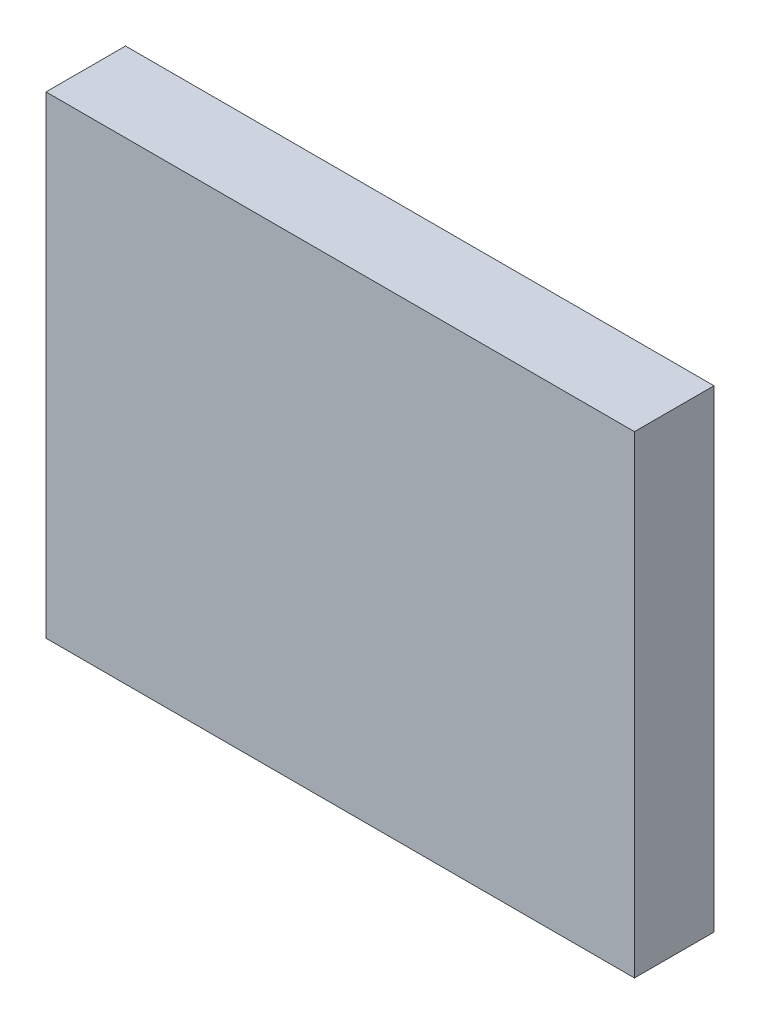
ISO-10303-21;
HEADER;
FILE_DESCRIPTION(('STEP AP214'),'2;1');
FILE_NAME('part.step','',(''),(''),'','','');
FILE_SCHEMA(('AUTOMOTIVE_DESIGN { 1 0 10303 214 1 1 1 1 }'));
ENDSEC;
DATA;
#1=APPLICATION_CONTEXT('core data for automotive mechanical design processes');
#2=APPLICATION_PROTOCOL_DEFINITION('international standard','automotive_design',2000,#1);
#3=PRODUCT_CONTEXT('',#1,'mechanical');
#4=PRODUCT('Part','Part','',(#3));
#5=PRODUCT_RELATED_PRODUCT_CATEGORY('part','',(#4));
#6=PRODUCT_DEFINITION_FORMATION('','',#4);
#7=PRODUCT_DEFINITION_CONTEXT('part definition',#1,'design');
#8=PRODUCT_DEFINITION('design','',#6,#7);
#9=PRODUCT_DEFINITION_SHAPE('','',#8);
#10=(LENGTH_UNIT() NAMED_UNIT(*) SI_UNIT(.MILLI.,.METRE.));
#11=(NAMED_UNIT(*) PLANE_ANGLE_UNIT() SI_UNIT($,.RADIAN.));
#12=(NAMED_UNIT(*) SI_UNIT($,.STERADIAN.) SOLID_ANGLE_UNIT());
#13=UNCERTAINTY_MEASURE_WITH_UNIT(LENGTH_MEASURE(1.E-05),#10,'distance_accuracy_value','');
#14=(GEOMETRIC_REPRESENTATION_CONTEXT(3) GLOBAL_UNCERTAINTY_ASSIGNED_CONTEXT((#13)) GLOBAL_UNIT_ASSIGNED_CONTEXT((#10,
#11,#12)) REPRESENTATION_CONTEXT('',''));
#15=CARTESIAN_POINT('',(0.,0.,0.));
#16=DIRECTION('',(0.,0.,1.));
#17=DIRECTION('',(1.,0.,0.));
#18=AXIS2_PLACEMENT_3D('',#15,#16,#17);
#19=CARTESIAN_POINT('',(-740.,1190.,200.));
#20=DIRECTION('',(1.,0.,0.));
#21=DIRECTION('',(0.,1.,0.));
#22=AXIS2_PLACEMENT_3D('',#19,#20,#21);
#23=PLANE('',#22);
#24=DIRECTION('',(0.,-1.,0.));
#25=VECTOR('',#24,1.);
#26=CARTESIAN_POINT('',(-740.,1190.,0.));
#27=LINE('',#26,#25);
#28=CARTESIAN_POINT('',(-740.,1190.,0.));
#29=VERTEX_POINT('',#28);
#30=CARTESIAN_POINT('',(-740.,0.,0.));
#31=VERTEX_POINT('',#30);
#32=EDGE_CURVE('E111',#29,#31,#27,.T.);
#33=ORIENTED_EDGE('',*,*,#32,.T.);
#34=DIRECTION('',(0.,0.,-1.));
#35=VECTOR('',#34,1.);
#36=CARTESIAN_POINT('',(-740.,0.,200.));
#37=LINE('',#36,#35);
#38=CARTESIAN_POINT('',(-740.,0.,200.));
#39=VERTEX_POINT('',#38);
#40=EDGE_CURVE('E11',#39,#31,#37,.T.);
#41=ORIENTED_EDGE('',*,*,#40,.F.);
#42=DIRECTION('',(0.,-1.,0.));
#43=VECTOR('',#42,1.);
#44=CARTESIAN_POINT('',(-740.,1190.,200.));
#45=LINE('',#44,#43);
#46=CARTESIAN_POINT('',(-740.,1190.,200.));
#47=VERTEX_POINT('',#46);
#48=EDGE_CURVE('E94',#47,#39,#45,.T.);
#49=ORIENTED_EDGE('',*,*,#48,.F.);
#50=DIRECTION('',(0.,0.,-1.));
#51=VECTOR('',#50,1.);
#52=CARTESIAN_POINT('',(-740.,1190.,200.));
#53=LINE('',#52,#51);
#54=EDGE_CURVE('E107',#47,#29,#53,.T.);
#55=ORIENTED_EDGE('',*,*,#54,.T.);
#56=EDGE_LOOP('',(#33,#41,#49,#55));
#57=FACE_BOUND('',#56,.T.);
#58=ADVANCED_FACE('F42',(#57),#23,.F.);
#59=CARTESIAN_POINT('',(-740.,0.,200.));
#60=DIRECTION('',(0.,1.,0.));
#61=DIRECTION('',(-1.,0.,0.));
#62=AXIS2_PLACEMENT_3D('',#59,#60,#61);
#63=PLANE('',#62);
#64=DIRECTION('',(1.,0.,0.));
#65=VECTOR('',#64,1.);
#66=CARTESIAN_POINT('',(-740.,0.,0.));
#67=LINE('',#66,#65);
#68=CARTESIAN_POINT('',(740.,2.78193187553388E-13,0.));
#69=VERTEX_POINT('',#68);
#70=EDGE_CURVE('E99',#31,#69,#67,.T.);
#71=ORIENTED_EDGE('',*,*,#70,.T.);
#72=DIRECTION('',(0.,0.,-1.));
#73=VECTOR('',#72,1.);
#74=CARTESIAN_POINT('',(740.,2.78193187553388E-13,200.));
#75=LINE('',#74,#73);
#76=CARTESIAN_POINT('',(740.,2.78193187553388E-13,200.));
#77=VERTEX_POINT('',#76);
#78=EDGE_CURVE('E51',#77,#69,#75,.T.);
#79=ORIENTED_EDGE('',*,*,#78,.F.);
#80=DIRECTION('',(1.,0.,0.));
#81=VECTOR('',#80,1.);
#82=CARTESIAN_POINT('',(-740.,0.,200.));
#83=LINE('',#82,#81);
#84=EDGE_CURVE('E89',#39,#77,#83,.T.);
#85=ORIENTED_EDGE('',*,*,#84,.F.);
#86=ORIENTED_EDGE('',*,*,#40,.T.);
#87=EDGE_LOOP('',(#71,#79,#85,#86));
#88=FACE_BOUND('',#87,.T.);
#89=ADVANCED_FACE('F98',(#88),#63,.F.);
#90=CARTESIAN_POINT('',(740.,1190.,200.));
#91=DIRECTION('',(-1.,0.,0.));
#92=DIRECTION('',(0.,-1.,0.));
#93=AXIS2_PLACEMENT_3D('',#90,#91,#92);
#94=PLANE('',#93);
#95=DIRECTION('',(0.,1.,0.));
#96=VECTOR('',#95,1.);
#97=CARTESIAN_POINT('',(740.,1190.,0.));
#98=LINE('',#97,#96);
#99=CARTESIAN_POINT('',(740.,1190.,0.));
#100=VERTEX_POINT('',#99);
#101=EDGE_CURVE('E76',#69,#100,#98,.T.);
#102=ORIENTED_EDGE('',*,*,#101,.T.);
#103=DIRECTION('',(0.,0.,-1.));
#104=VECTOR('',#103,1.);
#105=CARTESIAN_POINT('',(740.,1190.,200.));
#106=LINE('',#105,#104);
#107=CARTESIAN_POINT('',(740.,1190.,200.));
#108=VERTEX_POINT('',#107);
#109=EDGE_CURVE('E101',#108,#100,#106,.T.);
#110=ORIENTED_EDGE('',*,*,#109,.F.);
#111=DIRECTION('',(0.,1.,0.));
#112=VECTOR('',#111,1.);
#113=CARTESIAN_POINT('',(740.,1190.,200.));
#114=LINE('',#113,#112);
#115=EDGE_CURVE('E92',#77,#108,#114,.T.);
#116=ORIENTED_EDGE('',*,*,#115,.F.);
#117=ORIENTED_EDGE('',*,*,#78,.T.);
#118=EDGE_LOOP('',(#102,#110,#116,#117));
#119=FACE_BOUND('',#118,.T.);
#120=ADVANCED_FACE('F102',(#119),#94,.F.);
#121=CARTESIAN_POINT('',(-740.,1190.,200.));
#122=DIRECTION('',(0.,-1.,0.));
#123=DIRECTION('',(1.,0.,0.));
#124=AXIS2_PLACEMENT_3D('',#121,#122,#123);
#125=PLANE('',#124);
#126=DIRECTION('',(-1.,0.,0.));
#127=VECTOR('',#126,1.);
#128=CARTESIAN_POINT('',(-740.,1190.,0.));
#129=LINE('',#128,#127);
#130=EDGE_CURVE('E82',#100,#29,#129,.T.);
#131=ORIENTED_EDGE('',*,*,#130,.T.);
#132=ORIENTED_EDGE('',*,*,#54,.F.);
#133=DIRECTION('',(-1.,0.,0.));
#134=VECTOR('',#133,1.);
#135=CARTESIAN_POINT('',(-740.,1190.,200.));
#136=LINE('',#135,#134);
#137=EDGE_CURVE('E59',#108,#47,#136,.T.);
#138=ORIENTED_EDGE('',*,*,#137,.F.);
#139=ORIENTED_EDGE('',*,*,#109,.T.);
#140=EDGE_LOOP('',(#131,#132,#138,#139));
#141=FACE_BOUND('',#140,.T.);
#142=ADVANCED_FACE('F125',(#141),#125,.F.);
#143=CARTESIAN_POINT('',(0.,0.,200.));
#144=DIRECTION('',(0.,0.,1.));
#145=DIRECTION('',(1.,0.,0.));
#146=AXIS2_PLACEMENT_3D('',#143,#144,#145);
#147=PLANE('',#146);
#148=ORIENTED_EDGE('',*,*,#48,.T.);
#149=ORIENTED_EDGE('',*,*,#84,.T.);
#150=ORIENTED_EDGE('',*,*,#115,.T.);
#151=ORIENTED_EDGE('',*,*,#137,.T.);
#152=EDGE_LOOP('',(#148,#149,#150,#151));
#153=FACE_BOUND('',#152,.T.);
#154=ADVANCED_FACE('F90',(#153),#147,.T.);
#155=CARTESIAN_POINT('',(0.,0.,0.));
#156=DIRECTION('',(0.,0.,1.));
#157=DIRECTION('',(1.,0.,0.));
#158=AXIS2_PLACEMENT_3D('',#155,#156,#157);
#159=PLANE('',#158);
#160=ORIENTED_EDGE('',*,*,#32,.F.);
#161=ORIENTED_EDGE('',*,*,#130,.F.);
#162=ORIENTED_EDGE('',*,*,#101,.F.);
#163=ORIENTED_EDGE('',*,*,#70,.F.);
#164=EDGE_LOOP('',(#160,#161,#162,#163));
#165=FACE_BOUND('',#164,.T.);
#166=ADVANCED_FACE('F128',(#165),#159,.F.);
#167=CLOSED_SHELL('',(#58,#89,#120,#142,#154,#166));
#168=MANIFOLD_SOLID_BREP('B2',#167);
#169=ADVANCED_BREP_SHAPE_REPRESENTATION('',(#18,#168),#14);
#170=SHAPE_DEFINITION_REPRESENTATION(#9,#169);
ENDSEC;
END-ISO-10303-21;
